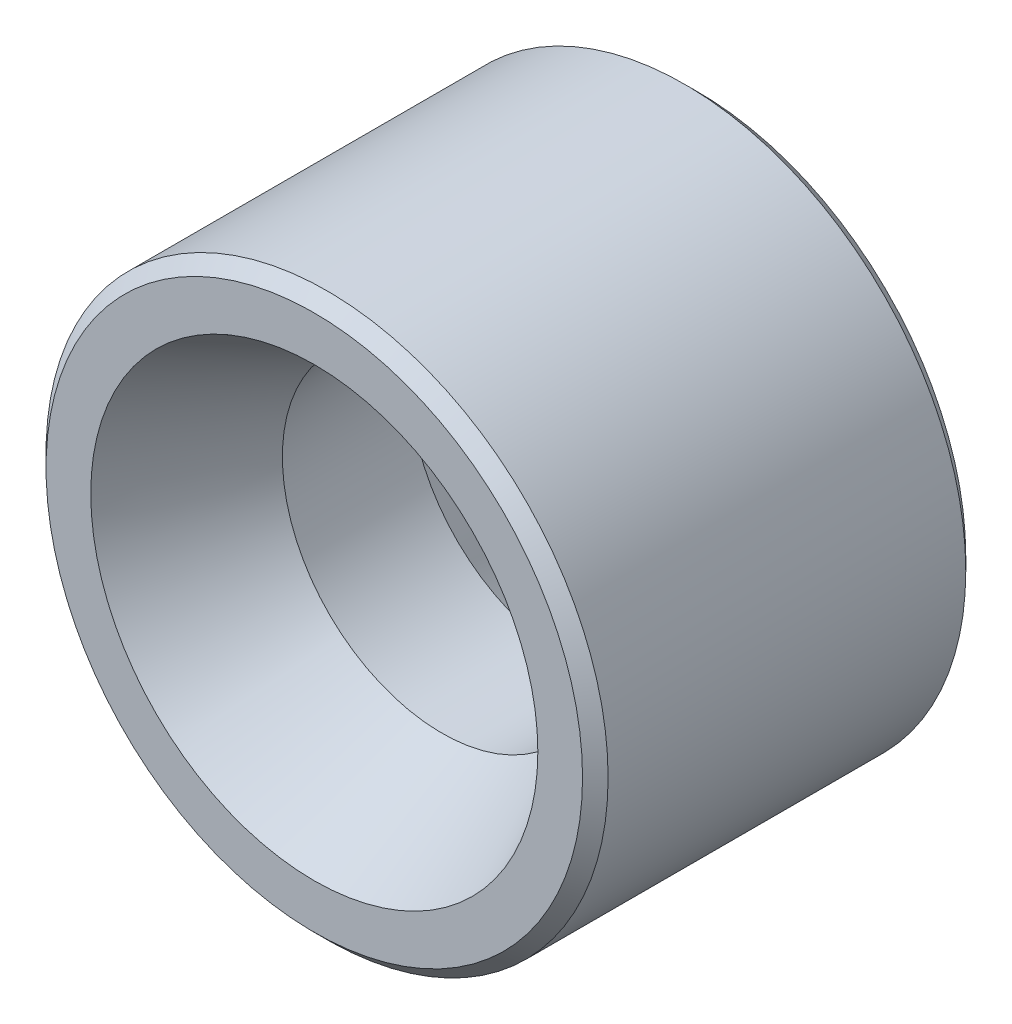
ISO-10303-21;
HEADER;
FILE_DESCRIPTION(('STEP AP214'),'2;1');
FILE_NAME('part.step','',(''),(''),'','','');
FILE_SCHEMA(('AUTOMOTIVE_DESIGN { 1 0 10303 214 1 1 1 1 }'));
ENDSEC;
DATA;
#1=APPLICATION_CONTEXT('core data for automotive mechanical design processes');
#2=APPLICATION_PROTOCOL_DEFINITION('international standard','automotive_design',2000,#1);
#3=PRODUCT_CONTEXT('',#1,'mechanical');
#4=PRODUCT('Part','Part','',(#3));
#5=PRODUCT_RELATED_PRODUCT_CATEGORY('part','',(#4));
#6=PRODUCT_DEFINITION_FORMATION('','',#4);
#7=PRODUCT_DEFINITION_CONTEXT('part definition',#1,'design');
#8=PRODUCT_DEFINITION('design','',#6,#7);
#9=PRODUCT_DEFINITION_SHAPE('','',#8);
#10=(LENGTH_UNIT() NAMED_UNIT(*) SI_UNIT(.MILLI.,.METRE.));
#11=(NAMED_UNIT(*) PLANE_ANGLE_UNIT() SI_UNIT($,.RADIAN.));
#12=(NAMED_UNIT(*) SI_UNIT($,.STERADIAN.) SOLID_ANGLE_UNIT());
#13=UNCERTAINTY_MEASURE_WITH_UNIT(LENGTH_MEASURE(1.E-05),#10,'distance_accuracy_value','');
#14=(GEOMETRIC_REPRESENTATION_CONTEXT(3) GLOBAL_UNCERTAINTY_ASSIGNED_CONTEXT((#13)) GLOBAL_UNIT_ASSIGNED_CONTEXT((#10,
#11,#12)) REPRESENTATION_CONTEXT('',''));
#15=CARTESIAN_POINT('',(0.,0.,0.));
#16=DIRECTION('',(0.,0.,1.));
#17=DIRECTION('',(1.,0.,0.));
#18=AXIS2_PLACEMENT_3D('',#15,#16,#17);
#19=CARTESIAN_POINT('',(0.,0.,15.));
#20=DIRECTION('',(0.,0.,1.));
#21=DIRECTION('',(1.,0.,0.));
#22=AXIS2_PLACEMENT_3D('',#19,#20,#21);
#23=PLANE('',#22);
#24=CARTESIAN_POINT('',(0.,0.,15.));
#25=DIRECTION('',(0.,0.,1.));
#26=DIRECTION('',(1.,0.,0.));
#27=AXIS2_PLACEMENT_3D('',#24,#25,#26);
#28=CIRCLE('',#27,17.5);
#29=CARTESIAN_POINT('',(17.5,0.,15.));
#30=VERTEX_POINT('',#29);
#31=EDGE_CURVE('E52',#30,#30,#28,.F.);
#32=ORIENTED_EDGE('',*,*,#31,.T.);
#33=EDGE_LOOP('',(#32));
#34=FACE_BOUND('',#33,.T.);
#35=CARTESIAN_POINT('',(0.,0.,15.));
#36=DIRECTION('',(0.,0.,1.));
#37=DIRECTION('',(1.,0.,0.));
#38=AXIS2_PLACEMENT_3D('',#35,#36,#37);
#39=CIRCLE('',#38,21.);
#40=CARTESIAN_POINT('',(21.,0.,15.));
#41=VERTEX_POINT('',#40);
#42=EDGE_CURVE('E61',#41,#41,#39,.T.);
#43=ORIENTED_EDGE('',*,*,#42,.T.);
#44=EDGE_LOOP('',(#43));
#45=FACE_BOUND('',#44,.T.);
#46=ADVANCED_FACE('F40',(#34,#45),#23,.T.);
#47=CARTESIAN_POINT('',(0.,0.,-15.));
#48=DIRECTION('',(0.,0.,1.));
#49=DIRECTION('',(1.,0.,0.));
#50=AXIS2_PLACEMENT_3D('',#47,#48,#49);
#51=PLANE('',#50);
#52=CARTESIAN_POINT('',(0.,0.,-15.));
#53=DIRECTION('',(0.,0.,1.));
#54=DIRECTION('',(1.,0.,0.));
#55=AXIS2_PLACEMENT_3D('',#52,#53,#54);
#56=CIRCLE('',#55,17.5);
#57=CARTESIAN_POINT('',(17.5,0.,-15.));
#58=VERTEX_POINT('',#57);
#59=EDGE_CURVE('E48',#58,#58,#56,.T.);
#60=ORIENTED_EDGE('',*,*,#59,.T.);
#61=EDGE_LOOP('',(#60));
#62=FACE_BOUND('',#61,.T.);
#63=CARTESIAN_POINT('',(0.,0.,-15.));
#64=DIRECTION('',(0.,0.,1.));
#65=DIRECTION('',(1.,0.,0.));
#66=AXIS2_PLACEMENT_3D('',#63,#64,#65);
#67=CIRCLE('',#66,21.);
#68=CARTESIAN_POINT('',(21.,0.,-15.));
#69=VERTEX_POINT('',#68);
#70=EDGE_CURVE('E64',#69,#69,#67,.F.);
#71=ORIENTED_EDGE('',*,*,#70,.T.);
#72=EDGE_LOOP('',(#71));
#73=FACE_BOUND('',#72,.T.);
#74=ADVANCED_FACE('F85',(#62,#73),#51,.F.);
#75=CARTESIAN_POINT('',(0.,0.,15.));
#76=DIRECTION('',(0.,0.,-1.));
#77=DIRECTION('',(-1.,0.,0.));
#78=AXIS2_PLACEMENT_3D('',#75,#76,#77);
#79=CYLINDRICAL_SURFACE('',#78,22.);
#80=CARTESIAN_POINT('',(0.,0.,-14.));
#81=DIRECTION('',(0.,0.,1.));
#82=DIRECTION('',(1.,0.,0.));
#83=AXIS2_PLACEMENT_3D('',#80,#81,#82);
#84=CIRCLE('',#83,22.);
#85=CARTESIAN_POINT('',(22.,0.,-14.));
#86=VERTEX_POINT('',#85);
#87=EDGE_CURVE('E67',#86,#86,#84,.T.);
#88=ORIENTED_EDGE('',*,*,#87,.T.);
#89=EDGE_LOOP('',(#88));
#90=FACE_BOUND('',#89,.T.);
#91=CARTESIAN_POINT('',(0.,0.,14.));
#92=DIRECTION('',(0.,0.,1.));
#93=DIRECTION('',(1.,0.,0.));
#94=AXIS2_PLACEMENT_3D('',#91,#92,#93);
#95=CIRCLE('',#94,22.);
#96=CARTESIAN_POINT('',(22.,0.,14.));
#97=VERTEX_POINT('',#96);
#98=EDGE_CURVE('E70',#97,#97,#95,.F.);
#99=ORIENTED_EDGE('',*,*,#98,.T.);
#100=EDGE_LOOP('',(#99));
#101=FACE_BOUND('',#100,.T.);
#102=ADVANCED_FACE('F74',(#90,#101),#79,.T.);
#103=CARTESIAN_POINT('',(0.,0.,15.));
#104=DIRECTION('',(0.,0.,-1.));
#105=DIRECTION('',(-1.,0.,0.));
#106=AXIS2_PLACEMENT_3D('',#103,#104,#105);
#107=CYLINDRICAL_SURFACE('',#106,12.5);
#108=CARTESIAN_POINT('',(0.,0.,-4.99999999999996));
#109=DIRECTION('',(0.,0.,1.));
#110=DIRECTION('',(1.,0.,0.));
#111=AXIS2_PLACEMENT_3D('',#108,#109,#110);
#112=CIRCLE('',#111,12.5);
#113=CARTESIAN_POINT('',(12.5,0.,-4.99999999999996));
#114=VERTEX_POINT('',#113);
#115=EDGE_CURVE('E10',#114,#114,#112,.F.);
#116=ORIENTED_EDGE('',*,*,#115,.T.);
#117=EDGE_LOOP('',(#116));
#118=FACE_BOUND('',#117,.T.);
#119=CARTESIAN_POINT('',(0.,0.,4.99999999999996));
#120=DIRECTION('',(0.,0.,1.));
#121=DIRECTION('',(1.,0.,0.));
#122=AXIS2_PLACEMENT_3D('',#119,#120,#121);
#123=CIRCLE('',#122,12.5);
#124=CARTESIAN_POINT('',(12.5,0.,4.99999999999996));
#125=VERTEX_POINT('',#124);
#126=EDGE_CURVE('E56',#125,#125,#123,.T.);
#127=ORIENTED_EDGE('',*,*,#126,.T.);
#128=EDGE_LOOP('',(#127));
#129=FACE_BOUND('',#128,.T.);
#130=ADVANCED_FACE('F94',(#118,#129),#107,.F.);
#131=CARTESIAN_POINT('',(0.,0.,-14.));
#132=DIRECTION('',(0.,0.,1.));
#133=DIRECTION('',(1.,0.,0.));
#134=AXIS2_PLACEMENT_3D('',#131,#132,#133);
#135=CONICAL_SURFACE('',#134,22.,0.785398163397452);
#136=ORIENTED_EDGE('',*,*,#70,.F.);
#137=EDGE_LOOP('',(#136));
#138=FACE_BOUND('',#137,.T.);
#139=ORIENTED_EDGE('',*,*,#87,.F.);
#140=EDGE_LOOP('',(#139));
#141=FACE_BOUND('',#140,.T.);
#142=ADVANCED_FACE('F80',(#138,#141),#135,.T.);
#143=CARTESIAN_POINT('',(0.,0.,15.));
#144=DIRECTION('',(0.,0.,-1.));
#145=DIRECTION('',(-1.,0.,0.));
#146=AXIS2_PLACEMENT_3D('',#143,#144,#145);
#147=CONICAL_SURFACE('',#146,21.,0.785398163397441);
#148=ORIENTED_EDGE('',*,*,#98,.F.);
#149=EDGE_LOOP('',(#148));
#150=FACE_BOUND('',#149,.T.);
#151=ORIENTED_EDGE('',*,*,#42,.F.);
#152=EDGE_LOOP('',(#151));
#153=FACE_BOUND('',#152,.T.);
#154=ADVANCED_FACE('F76',(#150,#153),#147,.T.);
#155=CARTESIAN_POINT('',(0.,0.,4.99999999999996));
#156=DIRECTION('',(0.,0.,1.));
#157=DIRECTION('',(1.,0.,0.));
#158=AXIS2_PLACEMENT_3D('',#155,#156,#157);
#159=CONICAL_SURFACE('',#158,12.5,0.463647609000804);
#160=ORIENTED_EDGE('',*,*,#31,.F.);
#161=EDGE_LOOP('',(#160));
#162=FACE_BOUND('',#161,.T.);
#163=ORIENTED_EDGE('',*,*,#126,.F.);
#164=EDGE_LOOP('',(#163));
#165=FACE_BOUND('',#164,.T.);
#166=ADVANCED_FACE('F79',(#162,#165),#159,.F.);
#167=CARTESIAN_POINT('',(0.,0.,-15.));
#168=DIRECTION('',(0.,0.,-1.));
#169=DIRECTION('',(-1.,0.,0.));
#170=AXIS2_PLACEMENT_3D('',#167,#168,#169);
#171=CONICAL_SURFACE('',#170,17.5,0.463647609000804);
#172=ORIENTED_EDGE('',*,*,#115,.F.);
#173=EDGE_LOOP('',(#172));
#174=FACE_BOUND('',#173,.T.);
#175=ORIENTED_EDGE('',*,*,#59,.F.);
#176=EDGE_LOOP('',(#175));
#177=FACE_BOUND('',#176,.T.);
#178=ADVANCED_FACE('F43',(#174,#177),#171,.F.);
#179=CLOSED_SHELL('',(#46,#74,#102,#130,#142,#154,#166,#178));
#180=MANIFOLD_SOLID_BREP('B2',#179);
#181=ADVANCED_BREP_SHAPE_REPRESENTATION('',(#18,#180),#14);
#182=SHAPE_DEFINITION_REPRESENTATION(#9,#181);
ENDSEC;
END-ISO-10303-21;
